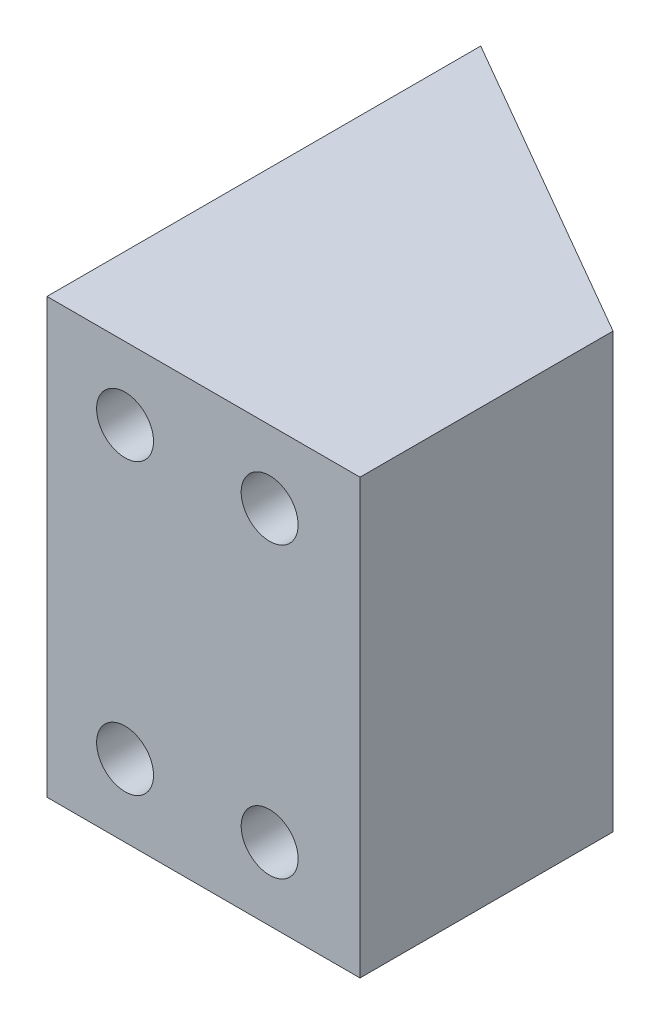
ISO-10303-21;
HEADER;
FILE_DESCRIPTION(('STEP AP214'),'2;1');
FILE_NAME('part.step','',(''),(''),'','','');
FILE_SCHEMA(('AUTOMOTIVE_DESIGN { 1 0 10303 214 1 1 1 1 }'));
ENDSEC;
DATA;
#1=APPLICATION_CONTEXT('core data for automotive mechanical design processes');
#2=APPLICATION_PROTOCOL_DEFINITION('international standard','automotive_design',2000,#1);
#3=PRODUCT_CONTEXT('',#1,'mechanical');
#4=PRODUCT('Part','Part','',(#3));
#5=PRODUCT_RELATED_PRODUCT_CATEGORY('part','',(#4));
#6=PRODUCT_DEFINITION_FORMATION('','',#4);
#7=PRODUCT_DEFINITION_CONTEXT('part definition',#1,'design');
#8=PRODUCT_DEFINITION('design','',#6,#7);
#9=PRODUCT_DEFINITION_SHAPE('','',#8);
#10=(LENGTH_UNIT() NAMED_UNIT(*) SI_UNIT(.MILLI.,.METRE.));
#11=(NAMED_UNIT(*) PLANE_ANGLE_UNIT() SI_UNIT($,.RADIAN.));
#12=(NAMED_UNIT(*) SI_UNIT($,.STERADIAN.) SOLID_ANGLE_UNIT());
#13=UNCERTAINTY_MEASURE_WITH_UNIT(LENGTH_MEASURE(1.E-05),#10,'distance_accuracy_value','');
#14=(GEOMETRIC_REPRESENTATION_CONTEXT(3) GLOBAL_UNCERTAINTY_ASSIGNED_CONTEXT((#13)) GLOBAL_UNIT_ASSIGNED_CONTEXT((#10,
#11,#12)) REPRESENTATION_CONTEXT('',''));
#15=CARTESIAN_POINT('',(0.,0.,0.));
#16=DIRECTION('',(0.,0.,1.));
#17=DIRECTION('',(1.,0.,0.));
#18=AXIS2_PLACEMENT_3D('',#15,#16,#17);
#19=CARTESIAN_POINT('',(-14.7878221735087,8.,39.6132593378112));
#20=DIRECTION('',(0.499999999999995,0.,-0.866025403784442));
#21=DIRECTION('',(-0.866025403784442,0.,-0.499999999999995));
#22=AXIS2_PLACEMENT_3D('',#19,#20,#21);
#23=CYLINDRICAL_SURFACE('',#22,4.1);
#24=CARTESIAN_POINT('',(0.,8.,14.0000000000001));
#25=DIRECTION('',(1.,0.,0.));
#26=DIRECTION('',(0.,0.,-1.));
#27=AXIS2_PLACEMENT_3D('',#24,#25,#26);
#28=ELLIPSE('',#27,8.20000000000008,4.1);
#29=CARTESIAN_POINT('',(0.,8.,5.80000000000004));
#30=VERTEX_POINT('',#29);
#31=EDGE_CURVE('E116',#30,#30,#28,.T.);
#32=ORIENTED_EDGE('',*,*,#31,.F.);
#33=EDGE_LOOP('',(#32));
#34=FACE_BOUND('',#33,.T.);
#35=CARTESIAN_POINT('',(4.5621778264911,8.,6.09807621135328));
#36=DIRECTION('',(0.499999999999995,0.,-0.866025403784442));
#37=DIRECTION('',(-0.866025403784442,0.,-0.499999999999995));
#38=AXIS2_PLACEMENT_3D('',#35,#36,#37);
#39=CIRCLE('',#38,4.1);
#40=CARTESIAN_POINT('',(1.01147367097489,8.,4.0480762113533));
#41=VERTEX_POINT('',#40);
#42=EDGE_CURVE('E11',#41,#41,#39,.F.);
#43=ORIENTED_EDGE('',*,*,#42,.F.);
#44=EDGE_LOOP('',(#43));
#45=FACE_BOUND('',#44,.T.);
#46=ADVANCED_FACE('F38',(#34,#45),#23,.F.);
#47=CARTESIAN_POINT('',(-14.7878221735087,40.,39.6132593378112));
#48=DIRECTION('',(0.499999999999995,0.,-0.866025403784442));
#49=DIRECTION('',(-0.866025403784442,0.,-0.499999999999995));
#50=AXIS2_PLACEMENT_3D('',#47,#48,#49);
#51=CYLINDRICAL_SURFACE('',#50,4.1);
#52=CARTESIAN_POINT('',(0.,40.,14.0000000000001));
#53=DIRECTION('',(1.,0.,0.));
#54=DIRECTION('',(0.,0.,-1.));
#55=AXIS2_PLACEMENT_3D('',#52,#53,#54);
#56=ELLIPSE('',#55,8.20000000000008,4.1);
#57=CARTESIAN_POINT('',(0.,40.,5.80000000000004));
#58=VERTEX_POINT('',#57);
#59=EDGE_CURVE('E109',#58,#58,#56,.T.);
#60=ORIENTED_EDGE('',*,*,#59,.F.);
#61=EDGE_LOOP('',(#60));
#62=FACE_BOUND('',#61,.T.);
#63=CARTESIAN_POINT('',(4.5621778264911,40.,6.09807621135328));
#64=DIRECTION('',(0.499999999999995,0.,-0.866025403784442));
#65=DIRECTION('',(-0.866025403784442,0.,-0.499999999999995));
#66=AXIS2_PLACEMENT_3D('',#63,#64,#65);
#67=CIRCLE('',#66,4.1);
#68=CARTESIAN_POINT('',(1.01147367097489,40.,4.0480762113533));
#69=VERTEX_POINT('',#68);
#70=EDGE_CURVE('E47',#69,#69,#67,.F.);
#71=ORIENTED_EDGE('',*,*,#70,.F.);
#72=EDGE_LOOP('',(#71));
#73=FACE_BOUND('',#72,.T.);
#74=ADVANCED_FACE('F126',(#62,#73),#51,.F.);
#75=CARTESIAN_POINT('',(34.6410161513777,48.,19.9999999999998));
#76=DIRECTION('',(-0.499999999999995,0.,0.866025403784442));
#77=DIRECTION('',(0.866025403784442,0.,0.499999999999995));
#78=AXIS2_PLACEMENT_3D('',#75,#76,#77);
#79=PLANE('',#78);
#80=DIRECTION('',(-0.866025403784442,0.,-0.499999999999995));
#81=VECTOR('',#80,1.);
#82=CARTESIAN_POINT('',(34.6410161513777,0.,19.9999999999998));
#83=LINE('',#82,#81);
#84=CARTESIAN_POINT('',(34.6410161513777,0.,19.9999999999998));
#85=VERTEX_POINT('',#84);
#86=CARTESIAN_POINT('',(0.,0.,0.));
#87=VERTEX_POINT('',#86);
#88=EDGE_CURVE('E106',#85,#87,#83,.T.);
#89=ORIENTED_EDGE('',*,*,#88,.T.);
#90=DIRECTION('',(0.,-1.,0.));
#91=VECTOR('',#90,1.);
#92=CARTESIAN_POINT('',(0.,48.,0.));
#93=LINE('',#92,#91);
#94=CARTESIAN_POINT('',(0.,48.,0.));
#95=VERTEX_POINT('',#94);
#96=EDGE_CURVE('E97',#95,#87,#93,.T.);
#97=ORIENTED_EDGE('',*,*,#96,.F.);
#98=DIRECTION('',(-0.866025403784442,0.,-0.499999999999995));
#99=VECTOR('',#98,1.);
#100=CARTESIAN_POINT('',(34.6410161513777,48.,19.9999999999998));
#101=LINE('',#100,#99);
#102=CARTESIAN_POINT('',(34.6410161513777,48.,19.9999999999998));
#103=VERTEX_POINT('',#102);
#104=EDGE_CURVE('E91',#103,#95,#101,.T.);
#105=ORIENTED_EDGE('',*,*,#104,.F.);
#106=DIRECTION('',(0.,-1.,0.));
#107=VECTOR('',#106,1.);
#108=CARTESIAN_POINT('',(34.6410161513777,48.,19.9999999999998));
#109=LINE('',#108,#107);
#110=EDGE_CURVE('E102',#103,#85,#109,.T.);
#111=ORIENTED_EDGE('',*,*,#110,.T.);
#112=EDGE_LOOP('',(#89,#97,#105,#111));
#113=FACE_BOUND('',#112,.T.);
#114=CARTESIAN_POINT('',(6.06217782649108,40.,3.49999999999996));
#115=DIRECTION('',(0.499999999999995,0.,-0.866025403784442));
#116=DIRECTION('',(-0.866025403784442,0.,-0.499999999999995));
#117=AXIS2_PLACEMENT_3D('',#114,#115,#116);
#118=CIRCLE('',#117,2.1);
#119=CARTESIAN_POINT('',(4.24352447854376,40.,2.44999999999997));
#120=VERTEX_POINT('',#119);
#121=EDGE_CURVE('E237',#120,#120,#118,.T.);
#122=ORIENTED_EDGE('',*,*,#121,.F.);
#123=EDGE_LOOP('',(#122));
#124=FACE_BOUND('',#123,.T.);
#125=CARTESIAN_POINT('',(6.06217782649108,8.,3.49999999999996));
#126=DIRECTION('',(0.499999999999995,0.,-0.866025403784442));
#127=DIRECTION('',(-0.866025403784442,0.,-0.499999999999995));
#128=AXIS2_PLACEMENT_3D('',#125,#126,#127);
#129=CIRCLE('',#128,2.1);
#130=CARTESIAN_POINT('',(4.24352447854375,8.,2.44999999999997));
#131=VERTEX_POINT('',#130);
#132=EDGE_CURVE('E243',#131,#131,#129,.T.);
#133=ORIENTED_EDGE('',*,*,#132,.F.);
#134=EDGE_LOOP('',(#133));
#135=FACE_BOUND('',#134,.T.);
#136=ADVANCED_FACE('F40',(#113,#124,#135),#79,.F.);
#137=CARTESIAN_POINT('',(0.,48.,19.9999999999998));
#138=DIRECTION('',(1.,0.,0.));
#139=DIRECTION('',(0.,0.,-1.));
#140=AXIS2_PLACEMENT_3D('',#137,#138,#139);
#141=PLANE('',#140);
#142=ORIENTED_EDGE('',*,*,#59,.T.);
#143=EDGE_LOOP('',(#142));
#144=FACE_BOUND('',#143,.T.);
#145=ORIENTED_EDGE('',*,*,#31,.T.);
#146=EDGE_LOOP('',(#145));
#147=FACE_BOUND('',#146,.T.);
#148=DIRECTION('',(0.,0.,1.));
#149=VECTOR('',#148,1.);
#150=CARTESIAN_POINT('',(0.,0.,19.9999999999998));
#151=LINE('',#150,#149);
#152=CARTESIAN_POINT('',(0.,0.,47.9999999999998));
#153=VERTEX_POINT('',#152);
#154=EDGE_CURVE('E96',#87,#153,#151,.T.);
#155=ORIENTED_EDGE('',*,*,#154,.T.);
#156=DIRECTION('',(0.,-1.,0.));
#157=VECTOR('',#156,1.);
#158=CARTESIAN_POINT('',(0.,48.,47.9999999999998));
#159=LINE('',#158,#157);
#160=CARTESIAN_POINT('',(0.,48.,47.9999999999998));
#161=VERTEX_POINT('',#160);
#162=EDGE_CURVE('E94',#161,#153,#159,.T.);
#163=ORIENTED_EDGE('',*,*,#162,.F.);
#164=DIRECTION('',(0.,0.,1.));
#165=VECTOR('',#164,1.);
#166=CARTESIAN_POINT('',(0.,48.,0.));
#167=LINE('',#166,#165);
#168=EDGE_CURVE('E86',#95,#161,#167,.T.);
#169=ORIENTED_EDGE('',*,*,#168,.F.);
#170=ORIENTED_EDGE('',*,*,#96,.T.);
#171=EDGE_LOOP('',(#155,#163,#169,#170));
#172=FACE_BOUND('',#171,.T.);
#173=ADVANCED_FACE('F95',(#144,#147,#172),#141,.F.);
#174=CARTESIAN_POINT('',(0.,48.,47.9999999999998));
#175=DIRECTION('',(0.,0.,-1.));
#176=DIRECTION('',(-1.,0.,0.));
#177=AXIS2_PLACEMENT_3D('',#174,#175,#176);
#178=PLANE('',#177);
#179=CARTESIAN_POINT('',(24.6410161513777,40.,47.9999999999998));
#180=DIRECTION('',(0.,0.,1.));
#181=DIRECTION('',(1.,0.,0.));
#182=AXIS2_PLACEMENT_3D('',#179,#180,#181);
#183=CIRCLE('',#182,3.14999999999998);
#184=CARTESIAN_POINT('',(27.7910161513777,40.,47.9999999999998));
#185=VERTEX_POINT('',#184);
#186=EDGE_CURVE('E226',#185,#185,#183,.T.);
#187=ORIENTED_EDGE('',*,*,#186,.F.);
#188=EDGE_LOOP('',(#187));
#189=FACE_BOUND('',#188,.T.);
#190=CARTESIAN_POINT('',(8.64101615137766,8.,47.9999999999998));
#191=DIRECTION('',(0.,0.,1.));
#192=DIRECTION('',(1.,0.,0.));
#193=AXIS2_PLACEMENT_3D('',#190,#191,#192);
#194=CIRCLE('',#193,3.15);
#195=CARTESIAN_POINT('',(11.7910161513777,8.,47.9999999999998));
#196=VERTEX_POINT('',#195);
#197=EDGE_CURVE('E219',#196,#196,#194,.T.);
#198=ORIENTED_EDGE('',*,*,#197,.F.);
#199=EDGE_LOOP('',(#198));
#200=FACE_BOUND('',#199,.T.);
#201=CARTESIAN_POINT('',(24.6410161513777,8.,47.9999999999998));
#202=DIRECTION('',(0.,0.,1.));
#203=DIRECTION('',(1.,0.,0.));
#204=AXIS2_PLACEMENT_3D('',#201,#202,#203);
#205=CIRCLE('',#204,3.14999999999998);
#206=CARTESIAN_POINT('',(27.7910161513776,8.,47.9999999999998));
#207=VERTEX_POINT('',#206);
#208=EDGE_CURVE('E231',#207,#207,#205,.T.);
#209=ORIENTED_EDGE('',*,*,#208,.F.);
#210=EDGE_LOOP('',(#209));
#211=FACE_BOUND('',#210,.T.);
#212=CARTESIAN_POINT('',(8.64101615137766,40.,47.9999999999998));
#213=DIRECTION('',(0.,0.,1.));
#214=DIRECTION('',(1.,0.,0.));
#215=AXIS2_PLACEMENT_3D('',#212,#213,#214);
#216=CIRCLE('',#215,3.15);
#217=CARTESIAN_POINT('',(11.7910161513777,40.,47.9999999999998));
#218=VERTEX_POINT('',#217);
#219=EDGE_CURVE('E213',#218,#218,#216,.T.);
#220=ORIENTED_EDGE('',*,*,#219,.F.);
#221=EDGE_LOOP('',(#220));
#222=FACE_BOUND('',#221,.T.);
#223=DIRECTION('',(1.,0.,0.));
#224=VECTOR('',#223,1.);
#225=CARTESIAN_POINT('',(0.,0.,47.9999999999998));
#226=LINE('',#225,#224);
#227=CARTESIAN_POINT('',(34.6410161513777,0.,47.9999999999998));
#228=VERTEX_POINT('',#227);
#229=EDGE_CURVE('E72',#153,#228,#226,.T.);
#230=ORIENTED_EDGE('',*,*,#229,.T.);
#231=DIRECTION('',(0.,-1.,0.));
#232=VECTOR('',#231,1.);
#233=CARTESIAN_POINT('',(34.6410161513777,48.,47.9999999999998));
#234=LINE('',#233,#232);
#235=CARTESIAN_POINT('',(34.6410161513777,48.,47.9999999999998));
#236=VERTEX_POINT('',#235);
#237=EDGE_CURVE('E98',#236,#228,#234,.T.);
#238=ORIENTED_EDGE('',*,*,#237,.F.);
#239=DIRECTION('',(1.,0.,0.));
#240=VECTOR('',#239,1.);
#241=CARTESIAN_POINT('',(0.,48.,47.9999999999998));
#242=LINE('',#241,#240);
#243=EDGE_CURVE('E89',#161,#236,#242,.T.);
#244=ORIENTED_EDGE('',*,*,#243,.F.);
#245=ORIENTED_EDGE('',*,*,#162,.T.);
#246=EDGE_LOOP('',(#230,#238,#244,#245));
#247=FACE_BOUND('',#246,.T.);
#248=ADVANCED_FACE('F100',(#189,#200,#211,#222,#247),#178,.F.);
#249=CARTESIAN_POINT('',(34.6410161513777,48.,19.9999999999998));
#250=DIRECTION('',(-1.,0.,0.));
#251=DIRECTION('',(0.,0.,1.));
#252=AXIS2_PLACEMENT_3D('',#249,#250,#251);
#253=PLANE('',#252);
#254=DIRECTION('',(0.,0.,-1.));
#255=VECTOR('',#254,1.);
#256=CARTESIAN_POINT('',(34.6410161513777,0.,19.9999999999998));
#257=LINE('',#256,#255);
#258=EDGE_CURVE('E78',#228,#85,#257,.T.);
#259=ORIENTED_EDGE('',*,*,#258,.T.);
#260=ORIENTED_EDGE('',*,*,#110,.F.);
#261=DIRECTION('',(0.,0.,-1.));
#262=VECTOR('',#261,1.);
#263=CARTESIAN_POINT('',(34.6410161513777,48.,19.9999999999998));
#264=LINE('',#263,#262);
#265=EDGE_CURVE('E55',#236,#103,#264,.T.);
#266=ORIENTED_EDGE('',*,*,#265,.F.);
#267=ORIENTED_EDGE('',*,*,#237,.T.);
#268=EDGE_LOOP('',(#259,#260,#266,#267));
#269=FACE_BOUND('',#268,.T.);
#270=ADVANCED_FACE('F145',(#269),#253,.F.);
#271=CARTESIAN_POINT('',(0.,48.,0.));
#272=DIRECTION('',(0.,1.,0.));
#273=DIRECTION('',(0.,0.,1.));
#274=AXIS2_PLACEMENT_3D('',#271,#272,#273);
#275=PLANE('',#274);
#276=ORIENTED_EDGE('',*,*,#104,.T.);
#277=ORIENTED_EDGE('',*,*,#168,.T.);
#278=ORIENTED_EDGE('',*,*,#243,.T.);
#279=ORIENTED_EDGE('',*,*,#265,.T.);
#280=EDGE_LOOP('',(#276,#277,#278,#279));
#281=FACE_BOUND('',#280,.T.);
#282=ADVANCED_FACE('F87',(#281),#275,.T.);
#283=CARTESIAN_POINT('',(0.,0.,0.));
#284=DIRECTION('',(0.,1.,0.));
#285=DIRECTION('',(0.,0.,1.));
#286=AXIS2_PLACEMENT_3D('',#283,#284,#285);
#287=PLANE('',#286);
#288=ORIENTED_EDGE('',*,*,#88,.F.);
#289=ORIENTED_EDGE('',*,*,#258,.F.);
#290=ORIENTED_EDGE('',*,*,#229,.F.);
#291=ORIENTED_EDGE('',*,*,#154,.F.);
#292=EDGE_LOOP('',(#288,#289,#290,#291));
#293=FACE_BOUND('',#292,.T.);
#294=ADVANCED_FACE('F144',(#293),#287,.F.);
#295=CARTESIAN_POINT('',(8.64101615137766,40.,43.2999999999998));
#296=DIRECTION('',(0.,0.,1.));
#297=DIRECTION('',(1.,0.,0.));
#298=AXIS2_PLACEMENT_3D('',#295,#296,#297);
#299=CYLINDRICAL_SURFACE('',#298,3.15);
#300=CARTESIAN_POINT('',(8.64101615137766,40.,43.2999999999998));
#301=DIRECTION('',(0.,0.,1.));
#302=DIRECTION('',(1.,0.,0.));
#303=AXIS2_PLACEMENT_3D('',#300,#301,#302);
#304=CIRCLE('',#303,3.15);
#305=CARTESIAN_POINT('',(11.7910161513777,40.,43.2999999999998));
#306=VERTEX_POINT('',#305);
#307=EDGE_CURVE('E119',#306,#306,#304,.T.);
#308=ORIENTED_EDGE('',*,*,#307,.F.);
#309=EDGE_LOOP('',(#308));
#310=FACE_BOUND('',#309,.T.);
#311=ORIENTED_EDGE('',*,*,#219,.T.);
#312=EDGE_LOOP('',(#311));
#313=FACE_BOUND('',#312,.T.);
#314=ADVANCED_FACE('F139',(#310,#313),#299,.F.);
#315=CARTESIAN_POINT('',(8.64101615137766,40.,43.2999999999998));
#316=DIRECTION('',(0.,0.,1.));
#317=DIRECTION('',(1.,0.,0.));
#318=AXIS2_PLACEMENT_3D('',#315,#316,#317);
#319=PLANE('',#318);
#320=ORIENTED_EDGE('',*,*,#307,.T.);
#321=EDGE_LOOP('',(#320));
#322=FACE_BOUND('',#321,.T.);
#323=ADVANCED_FACE('F190',(#322),#319,.T.);
#324=CARTESIAN_POINT('',(24.6410161513777,8.,43.2999999999998));
#325=DIRECTION('',(0.,0.,1.));
#326=DIRECTION('',(1.,0.,0.));
#327=AXIS2_PLACEMENT_3D('',#324,#325,#326);
#328=CYLINDRICAL_SURFACE('',#327,3.14999999999998);
#329=CARTESIAN_POINT('',(24.6410161513777,8.,43.2999999999998));
#330=DIRECTION('',(0.,0.,1.));
#331=DIRECTION('',(1.,0.,0.));
#332=AXIS2_PLACEMENT_3D('',#329,#330,#331);
#333=CIRCLE('',#332,3.14999999999998);
#334=CARTESIAN_POINT('',(27.7910161513776,8.,43.2999999999998));
#335=VERTEX_POINT('',#334);
#336=EDGE_CURVE('E223',#335,#335,#333,.T.);
#337=ORIENTED_EDGE('',*,*,#336,.F.);
#338=EDGE_LOOP('',(#337));
#339=FACE_BOUND('',#338,.T.);
#340=ORIENTED_EDGE('',*,*,#208,.T.);
#341=EDGE_LOOP('',(#340));
#342=FACE_BOUND('',#341,.T.);
#343=ADVANCED_FACE('F186',(#339,#342),#328,.F.);
#344=CARTESIAN_POINT('',(24.6410161513777,8.,43.2999999999998));
#345=DIRECTION('',(0.,0.,1.));
#346=DIRECTION('',(1.,0.,0.));
#347=AXIS2_PLACEMENT_3D('',#344,#345,#346);
#348=PLANE('',#347);
#349=ORIENTED_EDGE('',*,*,#336,.T.);
#350=EDGE_LOOP('',(#349));
#351=FACE_BOUND('',#350,.T.);
#352=ADVANCED_FACE('F182',(#351),#348,.T.);
#353=CARTESIAN_POINT('',(8.64101615137766,8.,43.2999999999998));
#354=DIRECTION('',(0.,0.,1.));
#355=DIRECTION('',(1.,0.,0.));
#356=AXIS2_PLACEMENT_3D('',#353,#354,#355);
#357=CYLINDRICAL_SURFACE('',#356,3.15);
#358=CARTESIAN_POINT('',(8.64101615137766,8.,43.2999999999998));
#359=DIRECTION('',(0.,0.,1.));
#360=DIRECTION('',(1.,0.,0.));
#361=AXIS2_PLACEMENT_3D('',#358,#359,#360);
#362=CIRCLE('',#361,3.15);
#363=CARTESIAN_POINT('',(11.7910161513777,8.,43.2999999999998));
#364=VERTEX_POINT('',#363);
#365=EDGE_CURVE('E222',#364,#364,#362,.T.);
#366=ORIENTED_EDGE('',*,*,#365,.F.);
#367=EDGE_LOOP('',(#366));
#368=FACE_BOUND('',#367,.T.);
#369=ORIENTED_EDGE('',*,*,#197,.T.);
#370=EDGE_LOOP('',(#369));
#371=FACE_BOUND('',#370,.T.);
#372=ADVANCED_FACE('F185',(#368,#371),#357,.F.);
#373=CARTESIAN_POINT('',(8.64101615137766,8.,43.2999999999998));
#374=DIRECTION('',(0.,0.,1.));
#375=DIRECTION('',(1.,0.,0.));
#376=AXIS2_PLACEMENT_3D('',#373,#374,#375);
#377=PLANE('',#376);
#378=ORIENTED_EDGE('',*,*,#365,.T.);
#379=EDGE_LOOP('',(#378));
#380=FACE_BOUND('',#379,.T.);
#381=ADVANCED_FACE('F198',(#380),#377,.T.);
#382=CARTESIAN_POINT('',(24.6410161513777,40.,43.2999999999998));
#383=DIRECTION('',(0.,0.,1.));
#384=DIRECTION('',(1.,0.,0.));
#385=AXIS2_PLACEMENT_3D('',#382,#383,#384);
#386=CYLINDRICAL_SURFACE('',#385,3.14999999999998);
#387=CARTESIAN_POINT('',(24.6410161513777,40.,43.2999999999998));
#388=DIRECTION('',(0.,0.,1.));
#389=DIRECTION('',(1.,0.,0.));
#390=AXIS2_PLACEMENT_3D('',#387,#388,#389);
#391=CIRCLE('',#390,3.14999999999998);
#392=CARTESIAN_POINT('',(27.7910161513777,40.,43.2999999999998));
#393=VERTEX_POINT('',#392);
#394=EDGE_CURVE('E216',#393,#393,#391,.T.);
#395=ORIENTED_EDGE('',*,*,#394,.F.);
#396=EDGE_LOOP('',(#395));
#397=FACE_BOUND('',#396,.T.);
#398=ORIENTED_EDGE('',*,*,#186,.T.);
#399=EDGE_LOOP('',(#398));
#400=FACE_BOUND('',#399,.T.);
#401=ADVANCED_FACE('F194',(#397,#400),#386,.F.);
#402=CARTESIAN_POINT('',(24.6410161513777,40.,43.2999999999998));
#403=DIRECTION('',(0.,0.,1.));
#404=DIRECTION('',(1.,0.,0.));
#405=AXIS2_PLACEMENT_3D('',#402,#403,#404);
#406=PLANE('',#405);
#407=ORIENTED_EDGE('',*,*,#394,.T.);
#408=EDGE_LOOP('',(#407));
#409=FACE_BOUND('',#408,.T.);
#410=ADVANCED_FACE('F180',(#409),#406,.T.);
#411=CARTESIAN_POINT('',(4.5621778264911,40.,6.09807621135328));
#412=DIRECTION('',(0.499999999999995,0.,-0.866025403784442));
#413=DIRECTION('',(-0.866025403784442,0.,-0.499999999999995));
#414=AXIS2_PLACEMENT_3D('',#411,#412,#413);
#415=PLANE('',#414);
#416=CARTESIAN_POINT('',(4.5621778264911,40.,6.09807621135328));
#417=DIRECTION('',(0.499999999999995,0.,-0.866025403784442));
#418=DIRECTION('',(-0.866025403784442,0.,-0.499999999999995));
#419=AXIS2_PLACEMENT_3D('',#416,#417,#418);
#420=CIRCLE('',#419,2.1);
#421=CARTESIAN_POINT('',(2.74352447854377,40.,5.04807621135329));
#422=VERTEX_POINT('',#421);
#423=EDGE_CURVE('E234',#422,#422,#420,.T.);
#424=ORIENTED_EDGE('',*,*,#423,.T.);
#425=EDGE_LOOP('',(#424));
#426=FACE_BOUND('',#425,.T.);
#427=ORIENTED_EDGE('',*,*,#70,.T.);
#428=EDGE_LOOP('',(#427));
#429=FACE_BOUND('',#428,.T.);
#430=ADVANCED_FACE('F124',(#426,#429),#415,.F.);
#431=CARTESIAN_POINT('',(4.5621778264911,40.,6.09807621135328));
#432=DIRECTION('',(0.499999999999995,0.,-0.866025403784442));
#433=DIRECTION('',(-0.866025403784442,0.,-0.499999999999995));
#434=AXIS2_PLACEMENT_3D('',#431,#432,#433);
#435=CYLINDRICAL_SURFACE('',#434,2.1);
#436=ORIENTED_EDGE('',*,*,#423,.F.);
#437=EDGE_LOOP('',(#436));
#438=FACE_BOUND('',#437,.T.);
#439=ORIENTED_EDGE('',*,*,#121,.T.);
#440=EDGE_LOOP('',(#439));
#441=FACE_BOUND('',#440,.T.);
#442=ADVANCED_FACE('F165',(#438,#441),#435,.F.);
#443=CARTESIAN_POINT('',(4.5621778264911,8.,6.09807621135328));
#444=DIRECTION('',(0.499999999999995,0.,-0.866025403784442));
#445=DIRECTION('',(-0.866025403784442,0.,-0.499999999999995));
#446=AXIS2_PLACEMENT_3D('',#443,#444,#445);
#447=PLANE('',#446);
#448=CARTESIAN_POINT('',(4.5621778264911,8.,6.09807621135328));
#449=DIRECTION('',(0.499999999999995,0.,-0.866025403784442));
#450=DIRECTION('',(-0.866025403784442,0.,-0.499999999999995));
#451=AXIS2_PLACEMENT_3D('',#448,#449,#450);
#452=CIRCLE('',#451,2.1);
#453=CARTESIAN_POINT('',(2.74352447854377,8.,5.04807621135329));
#454=VERTEX_POINT('',#453);
#455=EDGE_CURVE('E240',#454,#454,#452,.T.);
#456=ORIENTED_EDGE('',*,*,#455,.T.);
#457=EDGE_LOOP('',(#456));
#458=FACE_BOUND('',#457,.T.);
#459=ORIENTED_EDGE('',*,*,#42,.T.);
#460=EDGE_LOOP('',(#459));
#461=FACE_BOUND('',#460,.T.);
#462=ADVANCED_FACE('F162',(#458,#461),#447,.F.);
#463=CARTESIAN_POINT('',(4.5621778264911,8.,6.09807621135328));
#464=DIRECTION('',(0.499999999999995,0.,-0.866025403784442));
#465=DIRECTION('',(-0.866025403784442,0.,-0.499999999999995));
#466=AXIS2_PLACEMENT_3D('',#463,#464,#465);
#467=CYLINDRICAL_SURFACE('',#466,2.1);
#468=ORIENTED_EDGE('',*,*,#455,.F.);
#469=EDGE_LOOP('',(#468));
#470=FACE_BOUND('',#469,.T.);
#471=ORIENTED_EDGE('',*,*,#132,.T.);
#472=EDGE_LOOP('',(#471));
#473=FACE_BOUND('',#472,.T.);
#474=ADVANCED_FACE('F164',(#470,#473),#467,.F.);
#475=CLOSED_SHELL('',(#46,#74,#136,#173,#248,#270,#282,#294,#314,#323,#343,#352,#372,#381,#401,
#410,#430,#442,#462,#474));
#476=MANIFOLD_SOLID_BREP('B2',#475);
#477=ADVANCED_BREP_SHAPE_REPRESENTATION('',(#18,#476),#14);
#478=SHAPE_DEFINITION_REPRESENTATION(#9,#477);
ENDSEC;
END-ISO-10303-21;
